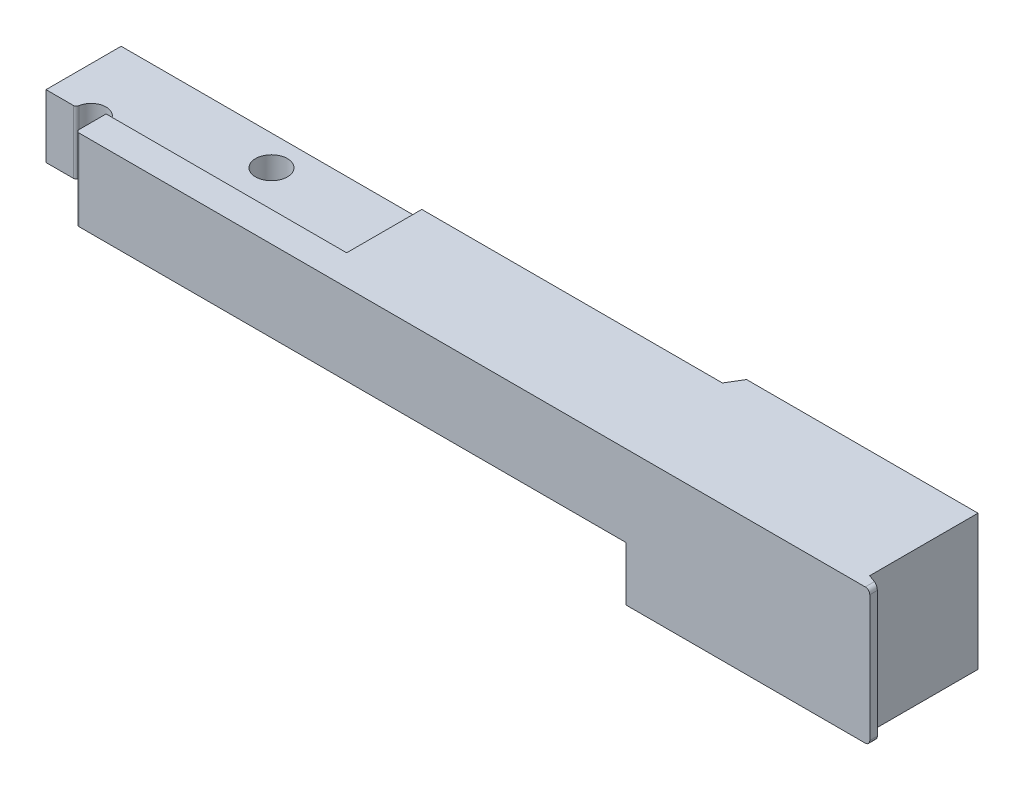
ISO-10303-21;
HEADER;
FILE_DESCRIPTION(('STEP AP214'),'2;1');
FILE_NAME('part.step','',(''),(''),'','','');
FILE_SCHEMA(('AUTOMOTIVE_DESIGN { 1 0 10303 214 1 1 1 1 }'));
ENDSEC;
DATA;
#1=APPLICATION_CONTEXT('core data for automotive mechanical design processes');
#2=APPLICATION_PROTOCOL_DEFINITION('international standard','automotive_design',2000,#1);
#3=PRODUCT_CONTEXT('',#1,'mechanical');
#4=PRODUCT('Part','Part','',(#3));
#5=PRODUCT_RELATED_PRODUCT_CATEGORY('part','',(#4));
#6=PRODUCT_DEFINITION_FORMATION('','',#4);
#7=PRODUCT_DEFINITION_CONTEXT('part definition',#1,'design');
#8=PRODUCT_DEFINITION('design','',#6,#7);
#9=PRODUCT_DEFINITION_SHAPE('','',#8);
#10=(LENGTH_UNIT() NAMED_UNIT(*) SI_UNIT(.MILLI.,.METRE.));
#11=(NAMED_UNIT(*) PLANE_ANGLE_UNIT() SI_UNIT($,.RADIAN.));
#12=(NAMED_UNIT(*) SI_UNIT($,.STERADIAN.) SOLID_ANGLE_UNIT());
#13=UNCERTAINTY_MEASURE_WITH_UNIT(LENGTH_MEASURE(1.E-05),#10,'distance_accuracy_value','');
#14=(GEOMETRIC_REPRESENTATION_CONTEXT(3) GLOBAL_UNCERTAINTY_ASSIGNED_CONTEXT((#13)) GLOBAL_UNIT_ASSIGNED_CONTEXT((#10,
#11,#12)) REPRESENTATION_CONTEXT('',''));
#15=CARTESIAN_POINT('',(0.,0.,0.));
#16=DIRECTION('',(0.,0.,1.));
#17=DIRECTION('',(1.,0.,0.));
#18=AXIS2_PLACEMENT_3D('',#15,#16,#17);
#19=CARTESIAN_POINT('',(0.,22.5,-20.));
#20=DIRECTION('',(0.,-1.,0.));
#21=DIRECTION('',(1.,0.,0.));
#22=AXIS2_PLACEMENT_3D('',#19,#20,#21);
#23=PLANE('',#22);
#24=DIRECTION('',(0.,0.,1.));
#25=VECTOR('',#24,1.);
#26=CARTESIAN_POINT('',(50.,22.5,-17.5));
#27=LINE('',#26,#25);
#28=CARTESIAN_POINT('',(50.,22.5,-17.5));
#29=VERTEX_POINT('',#28);
#30=CARTESIAN_POINT('',(50.,22.5,-5.));
#31=VERTEX_POINT('',#30);
#32=EDGE_CURVE('E199',#29,#31,#27,.T.);
#33=ORIENTED_EDGE('',*,*,#32,.T.);
#34=DIRECTION('',(-1.,0.,0.));
#35=VECTOR('',#34,1.);
#36=CARTESIAN_POINT('',(0.,22.5,-5.));
#37=LINE('',#36,#35);
#38=CARTESIAN_POINT('',(9.99999999999999,22.5,-5.));
#39=VERTEX_POINT('',#38);
#40=EDGE_CURVE('E454',#31,#39,#37,.T.);
#41=ORIENTED_EDGE('',*,*,#40,.T.);
#42=DIRECTION('',(0.,0.,-1.));
#43=VECTOR('',#42,1.);
#44=CARTESIAN_POINT('',(10.,22.5,0.));
#45=LINE('',#44,#43);
#46=CARTESIAN_POINT('',(10.,22.5,-0.5));
#47=VERTEX_POINT('',#46);
#48=EDGE_CURVE('E214',#47,#39,#45,.T.);
#49=ORIENTED_EDGE('',*,*,#48,.F.);
#50=CARTESIAN_POINT('',(10.5,22.5,-0.5));
#51=DIRECTION('',(0.,-1.,0.));
#52=DIRECTION('',(1.,0.,0.));
#53=AXIS2_PLACEMENT_3D('',#50,#51,#52);
#54=CIRCLE('',#53,0.5);
#55=CARTESIAN_POINT('',(10.5,22.5,0.));
#56=VERTEX_POINT('',#55);
#57=EDGE_CURVE('E308',#47,#56,#54,.F.);
#58=ORIENTED_EDGE('',*,*,#57,.T.);
#59=DIRECTION('',(1.,0.,0.));
#60=VECTOR('',#59,1.);
#61=CARTESIAN_POINT('',(0.,22.5,0.));
#62=LINE('',#61,#60);
#63=CARTESIAN_POINT('',(141.25,22.5,0.));
#64=VERTEX_POINT('',#63);
#65=EDGE_CURVE('E257',#56,#64,#62,.T.);
#66=ORIENTED_EDGE('',*,*,#65,.T.);
#67=DIRECTION('',(0.,0.,1.));
#68=VECTOR('',#67,1.);
#69=CARTESIAN_POINT('',(141.25,22.5,-1.24999999999999));
#70=LINE('',#69,#68);
#71=CARTESIAN_POINT('',(141.25,22.5,-1.52297767569964));
#72=VERTEX_POINT('',#71);
#73=EDGE_CURVE('E296',#64,#72,#70,.F.);
#74=ORIENTED_EDGE('',*,*,#73,.T.);
#75=DIRECTION('',(0.939692620785909,0.,0.342020143325667));
#76=VECTOR('',#75,1.);
#77=CARTESIAN_POINT('',(142.,22.5,-1.24999999999999));
#78=LINE('',#77,#76);
#79=CARTESIAN_POINT('',(140.,22.5,-1.97794046853239));
#80=VERTEX_POINT('',#79);
#81=EDGE_CURVE('E271',#72,#80,#78,.F.);
#82=ORIENTED_EDGE('',*,*,#81,.T.);
#83=DIRECTION('',(0.,0.,1.));
#84=VECTOR('',#83,1.);
#85=CARTESIAN_POINT('',(140.,22.5,-20.));
#86=LINE('',#85,#84);
#87=CARTESIAN_POINT('',(140.,22.5,-20.));
#88=VERTEX_POINT('',#87);
#89=EDGE_CURVE('E251',#88,#80,#86,.T.);
#90=ORIENTED_EDGE('',*,*,#89,.F.);
#91=DIRECTION('',(1.,0.,0.));
#92=VECTOR('',#91,1.);
#93=CARTESIAN_POINT('',(0.,22.5,-20.));
#94=LINE('',#93,#92);
#95=CARTESIAN_POINT('',(101.5,22.5,-20.));
#96=VERTEX_POINT('',#95);
#97=EDGE_CURVE('E258',#96,#88,#94,.T.);
#98=ORIENTED_EDGE('',*,*,#97,.F.);
#99=DIRECTION('',(-0.514495755427527,0.,0.857492925712544));
#100=VECTOR('',#99,1.);
#101=CARTESIAN_POINT('',(74.6323529411764,22.5,24.7794117647059));
#102=LINE('',#101,#100);
#103=CARTESIAN_POINT('',(100.,22.5,-17.5));
#104=VERTEX_POINT('',#103);
#105=EDGE_CURVE('E238',#96,#104,#102,.T.);
#106=ORIENTED_EDGE('',*,*,#105,.T.);
#107=DIRECTION('',(-1.,0.,0.));
#108=VECTOR('',#107,1.);
#109=CARTESIAN_POINT('',(0.,22.5,-17.5));
#110=LINE('',#109,#108);
#111=EDGE_CURVE('E246',#104,#29,#110,.T.);
#112=ORIENTED_EDGE('',*,*,#111,.T.);
#113=EDGE_LOOP('',(#33,#41,#49,#58,#66,#74,#82,#90,#98,#106,#112));
#114=FACE_BOUND('',#113,.T.);
#115=ADVANCED_FACE('F44',(#114),#23,.F.);
#116=CARTESIAN_POINT('',(100.,0.,-17.5));
#117=DIRECTION('',(0.,0.,1.));
#118=DIRECTION('',(1.,0.,0.));
#119=AXIS2_PLACEMENT_3D('',#116,#117,#118);
#120=PLANE('',#119);
#121=DIRECTION('',(0.,1.,0.));
#122=VECTOR('',#121,1.);
#123=CARTESIAN_POINT('',(50.,21.,-17.5));
#124=LINE('',#123,#122);
#125=CARTESIAN_POINT('',(50.,21.,-17.5));
#126=VERTEX_POINT('',#125);
#127=EDGE_CURVE('E339',#126,#29,#124,.T.);
#128=ORIENTED_EDGE('',*,*,#127,.T.);
#129=ORIENTED_EDGE('',*,*,#111,.F.);
#130=DIRECTION('',(0.,1.,0.));
#131=VECTOR('',#130,1.);
#132=CARTESIAN_POINT('',(100.,0.,-17.5));
#133=LINE('',#132,#131);
#134=CARTESIAN_POINT('',(100.,9.,-17.5));
#135=VERTEX_POINT('',#134);
#136=EDGE_CURVE('E233',#135,#104,#133,.T.);
#137=ORIENTED_EDGE('',*,*,#136,.F.);
#138=DIRECTION('',(1.,0.,0.));
#139=VECTOR('',#138,1.);
#140=CARTESIAN_POINT('',(0.,9.,-17.5));
#141=LINE('',#140,#139);
#142=CARTESIAN_POINT('',(50.,9.,-17.5));
#143=VERTEX_POINT('',#142);
#144=EDGE_CURVE('E376',#143,#135,#141,.T.);
#145=ORIENTED_EDGE('',*,*,#144,.F.);
#146=DIRECTION('',(0.,-1.,0.));
#147=VECTOR('',#146,1.);
#148=CARTESIAN_POINT('',(50.,10.5,-17.5));
#149=LINE('',#148,#147);
#150=CARTESIAN_POINT('',(50.,10.5,-17.5));
#151=VERTEX_POINT('',#150);
#152=EDGE_CURVE('E66',#151,#143,#149,.T.);
#153=ORIENTED_EDGE('',*,*,#152,.F.);
#154=DIRECTION('',(1.,0.,0.));
#155=VECTOR('',#154,1.);
#156=CARTESIAN_POINT('',(0.,10.5,-17.5));
#157=LINE('',#156,#155);
#158=CARTESIAN_POINT('',(0.,10.5,-17.5));
#159=VERTEX_POINT('',#158);
#160=EDGE_CURVE('E352',#159,#151,#157,.T.);
#161=ORIENTED_EDGE('',*,*,#160,.F.);
#162=DIRECTION('',(0.,1.,0.));
#163=VECTOR('',#162,1.);
#164=CARTESIAN_POINT('',(0.,0.,-17.5));
#165=LINE('',#164,#163);
#166=CARTESIAN_POINT('',(0.,21.,-17.5));
#167=VERTEX_POINT('',#166);
#168=EDGE_CURVE('E236',#159,#167,#165,.T.);
#169=ORIENTED_EDGE('',*,*,#168,.T.);
#170=DIRECTION('',(1.,0.,0.));
#171=VECTOR('',#170,1.);
#172=CARTESIAN_POINT('',(0.,21.,-17.5));
#173=LINE('',#172,#171);
#174=EDGE_CURVE('E194',#167,#126,#173,.T.);
#175=ORIENTED_EDGE('',*,*,#174,.T.);
#176=EDGE_LOOP('',(#128,#129,#137,#145,#153,#161,#169,#175));
#177=FACE_BOUND('',#176,.T.);
#178=ADVANCED_FACE('F433',(#177),#120,.F.);
#179=CARTESIAN_POINT('',(0.,0.,-20.));
#180=DIRECTION('',(0.,-1.,0.));
#181=DIRECTION('',(1.,0.,0.));
#182=AXIS2_PLACEMENT_3D('',#179,#180,#181);
#183=PLANE('',#182);
#184=DIRECTION('',(0.,0.,1.));
#185=VECTOR('',#184,1.);
#186=CARTESIAN_POINT('',(101.5,0.,-20.001));
#187=LINE('',#186,#185);
#188=CARTESIAN_POINT('',(101.5,0.,-20.));
#189=VERTEX_POINT('',#188);
#190=CARTESIAN_POINT('',(101.5,0.,0.));
#191=VERTEX_POINT('',#190);
#192=EDGE_CURVE('E220',#189,#191,#187,.T.);
#193=ORIENTED_EDGE('',*,*,#192,.F.);
#194=DIRECTION('',(1.,0.,0.));
#195=VECTOR('',#194,1.);
#196=CARTESIAN_POINT('',(0.,0.,-20.));
#197=LINE('',#196,#195);
#198=CARTESIAN_POINT('',(140.,0.,-20.));
#199=VERTEX_POINT('',#198);
#200=EDGE_CURVE('E260',#189,#199,#197,.T.);
#201=ORIENTED_EDGE('',*,*,#200,.T.);
#202=DIRECTION('',(0.,0.,1.));
#203=VECTOR('',#202,1.);
#204=CARTESIAN_POINT('',(140.,0.,-20.));
#205=LINE('',#204,#203);
#206=CARTESIAN_POINT('',(140.,0.,-1.97794046853239));
#207=VERTEX_POINT('',#206);
#208=EDGE_CURVE('E249',#199,#207,#205,.T.);
#209=ORIENTED_EDGE('',*,*,#208,.T.);
#210=DIRECTION('',(-0.939692620785909,0.,-0.342020143325667));
#211=VECTOR('',#210,1.);
#212=CARTESIAN_POINT('',(10.5847106977411,0.,-49.0812536335036));
#213=LINE('',#212,#211);
#214=CARTESIAN_POINT('',(141.25,0.,-1.52297767569964));
#215=VERTEX_POINT('',#214);
#216=EDGE_CURVE('E273',#207,#215,#213,.F.);
#217=ORIENTED_EDGE('',*,*,#216,.T.);
#218=DIRECTION('',(0.,0.,1.));
#219=VECTOR('',#218,1.);
#220=CARTESIAN_POINT('',(141.25,0.,-20.));
#221=LINE('',#220,#219);
#222=CARTESIAN_POINT('',(141.25,0.,0.));
#223=VERTEX_POINT('',#222);
#224=EDGE_CURVE('E279',#215,#223,#221,.T.);
#225=ORIENTED_EDGE('',*,*,#224,.T.);
#226=DIRECTION('',(1.,0.,0.));
#227=VECTOR('',#226,1.);
#228=CARTESIAN_POINT('',(0.,0.,0.));
#229=LINE('',#228,#227);
#230=EDGE_CURVE('E261',#191,#223,#229,.T.);
#231=ORIENTED_EDGE('',*,*,#230,.F.);
#232=EDGE_LOOP('',(#193,#201,#209,#217,#225,#231));
#233=FACE_BOUND('',#232,.T.);
#234=ADVANCED_FACE('F394',(#233),#183,.T.);
#235=CARTESIAN_POINT('',(142.,0.,-20.));
#236=DIRECTION('',(1.,0.,0.));
#237=DIRECTION('',(0.,0.,-1.));
#238=AXIS2_PLACEMENT_3D('',#235,#236,#237);
#239=PLANE('',#238);
#240=DIRECTION('',(0.,1.,0.));
#241=VECTOR('',#240,1.);
#242=CARTESIAN_POINT('',(142.,0.,0.));
#243=LINE('',#242,#241);
#244=CARTESIAN_POINT('',(142.,0.750000000000017,0.));
#245=VERTEX_POINT('',#244);
#246=CARTESIAN_POINT('',(142.,21.75,0.));
#247=VERTEX_POINT('',#246);
#248=EDGE_CURVE('E265',#245,#247,#243,.T.);
#249=ORIENTED_EDGE('',*,*,#248,.F.);
#250=DIRECTION('',(0.,0.,1.));
#251=VECTOR('',#250,1.);
#252=CARTESIAN_POINT('',(142.,0.750000000000017,-20.));
#253=LINE('',#252,#251);
#254=CARTESIAN_POINT('',(142.,0.750000000000017,-1.24999999999999));
#255=VERTEX_POINT('',#254);
#256=EDGE_CURVE('E290',#245,#255,#253,.F.);
#257=ORIENTED_EDGE('',*,*,#256,.T.);
#258=DIRECTION('',(0.,1.,0.));
#259=VECTOR('',#258,1.);
#260=CARTESIAN_POINT('',(142.,0.,-1.24999999999999));
#261=LINE('',#260,#259);
#262=CARTESIAN_POINT('',(142.,21.75,-1.24999999999999));
#263=VERTEX_POINT('',#262);
#264=EDGE_CURVE('E263',#255,#263,#261,.T.);
#265=ORIENTED_EDGE('',*,*,#264,.T.);
#266=DIRECTION('',(0.,0.,1.));
#267=VECTOR('',#266,1.);
#268=CARTESIAN_POINT('',(142.,21.75,0.));
#269=LINE('',#268,#267);
#270=EDGE_CURVE('E287',#263,#247,#269,.T.);
#271=ORIENTED_EDGE('',*,*,#270,.T.);
#272=EDGE_LOOP('',(#249,#257,#265,#271));
#273=FACE_BOUND('',#272,.T.);
#274=ADVANCED_FACE('F403',(#273),#239,.T.);
#275=CARTESIAN_POINT('',(0.,0.,-20.));
#276=DIRECTION('',(1.,0.,0.));
#277=DIRECTION('',(0.,0.,-1.));
#278=AXIS2_PLACEMENT_3D('',#275,#276,#277);
#279=PLANE('',#278);
#280=DIRECTION('',(0.,1.,0.));
#281=VECTOR('',#280,1.);
#282=CARTESIAN_POINT('',(0.,-0.00100000000003569,-5.));
#283=LINE('',#282,#281);
#284=CARTESIAN_POINT('',(0.,10.5,-5.));
#285=VERTEX_POINT('',#284);
#286=CARTESIAN_POINT('',(0.,21.,-5.));
#287=VERTEX_POINT('',#286);
#288=EDGE_CURVE('E206',#285,#287,#283,.T.);
#289=ORIENTED_EDGE('',*,*,#288,.T.);
#290=DIRECTION('',(0.,0.,-1.));
#291=VECTOR('',#290,1.);
#292=CARTESIAN_POINT('',(0.,21.,-17.5));
#293=LINE('',#292,#291);
#294=EDGE_CURVE('E188',#287,#167,#293,.T.);
#295=ORIENTED_EDGE('',*,*,#294,.T.);
#296=ORIENTED_EDGE('',*,*,#168,.F.);
#297=DIRECTION('',(0.,0.,-1.));
#298=VECTOR('',#297,1.);
#299=CARTESIAN_POINT('',(0.,10.5,-17.5));
#300=LINE('',#299,#298);
#301=EDGE_CURVE('E213',#285,#159,#300,.T.);
#302=ORIENTED_EDGE('',*,*,#301,.F.);
#303=EDGE_LOOP('',(#289,#295,#296,#302));
#304=FACE_BOUND('',#303,.T.);
#305=ADVANCED_FACE('F212',(#304),#279,.F.);
#306=CARTESIAN_POINT('',(0.,0.,-20.));
#307=DIRECTION('',(0.,0.,-1.));
#308=DIRECTION('',(-1.,0.,0.));
#309=AXIS2_PLACEMENT_3D('',#306,#307,#308);
#310=PLANE('',#309);
#311=CARTESIAN_POINT('',(115.5,11.25,-20.));
#312=DIRECTION('',(0.,0.,-1.));
#313=DIRECTION('',(-1.,0.,0.));
#314=AXIS2_PLACEMENT_3D('',#311,#312,#313);
#315=CIRCLE('',#314,3.35);
#316=CARTESIAN_POINT('',(112.15,11.25,-20.));
#317=VERTEX_POINT('',#316);
#318=EDGE_CURVE('E226',#317,#317,#315,.T.);
#319=ORIENTED_EDGE('',*,*,#318,.F.);
#320=EDGE_LOOP('',(#319));
#321=FACE_BOUND('',#320,.T.);
#322=DIRECTION('',(0.,1.,0.));
#323=VECTOR('',#322,1.);
#324=CARTESIAN_POINT('',(101.5,0.,-20.));
#325=LINE('',#324,#323);
#326=CARTESIAN_POINT('',(101.5,9.,-20.));
#327=VERTEX_POINT('',#326);
#328=EDGE_CURVE('E239',#189,#327,#325,.T.);
#329=ORIENTED_EDGE('',*,*,#328,.T.);
#330=EDGE_CURVE('E242',#327,#96,#325,.T.);
#331=ORIENTED_EDGE('',*,*,#330,.T.);
#332=ORIENTED_EDGE('',*,*,#97,.T.);
#333=DIRECTION('',(0.,1.,0.));
#334=VECTOR('',#333,1.);
#335=CARTESIAN_POINT('',(140.,0.,-20.));
#336=LINE('',#335,#334);
#337=EDGE_CURVE('E254',#199,#88,#336,.T.);
#338=ORIENTED_EDGE('',*,*,#337,.F.);
#339=ORIENTED_EDGE('',*,*,#200,.F.);
#340=EDGE_LOOP('',(#329,#331,#332,#338,#339));
#341=FACE_BOUND('',#340,.T.);
#342=ADVANCED_FACE('F441',(#321,#341),#310,.T.);
#343=CARTESIAN_POINT('',(0.,0.,0.));
#344=DIRECTION('',(0.,0.,-1.));
#345=DIRECTION('',(-1.,0.,0.));
#346=AXIS2_PLACEMENT_3D('',#343,#344,#345);
#347=PLANE('',#346);
#348=DIRECTION('',(-1.,0.,0.));
#349=VECTOR('',#348,1.);
#350=CARTESIAN_POINT('',(0.,9.,0.));
#351=LINE('',#350,#349);
#352=CARTESIAN_POINT('',(101.5,9.,0.));
#353=VERTEX_POINT('',#352);
#354=CARTESIAN_POINT('',(10.5,9.,0.));
#355=VERTEX_POINT('',#354);
#356=EDGE_CURVE('E381',#353,#355,#351,.T.);
#357=ORIENTED_EDGE('',*,*,#356,.F.);
#358=DIRECTION('',(0.,1.,0.));
#359=VECTOR('',#358,1.);
#360=CARTESIAN_POINT('',(101.5,0.,0.));
#361=LINE('',#360,#359);
#362=EDGE_CURVE('E378',#191,#353,#361,.T.);
#363=ORIENTED_EDGE('',*,*,#362,.F.);
#364=ORIENTED_EDGE('',*,*,#230,.T.);
#365=CARTESIAN_POINT('',(141.25,0.750000000000017,0.));
#366=DIRECTION('',(0.,0.,-1.));
#367=DIRECTION('',(-1.,0.,0.));
#368=AXIS2_PLACEMENT_3D('',#365,#366,#367);
#369=CIRCLE('',#368,0.75);
#370=EDGE_CURVE('E285',#223,#245,#369,.F.);
#371=ORIENTED_EDGE('',*,*,#370,.T.);
#372=ORIENTED_EDGE('',*,*,#248,.T.);
#373=CARTESIAN_POINT('',(141.25,21.75,0.));
#374=DIRECTION('',(0.,0.,-1.));
#375=DIRECTION('',(-1.,0.,0.));
#376=AXIS2_PLACEMENT_3D('',#373,#374,#375);
#377=CIRCLE('',#376,0.75);
#378=EDGE_CURVE('E282',#247,#64,#377,.F.);
#379=ORIENTED_EDGE('',*,*,#378,.T.);
#380=ORIENTED_EDGE('',*,*,#65,.F.);
#381=DIRECTION('',(0.,1.,0.));
#382=VECTOR('',#381,1.);
#383=CARTESIAN_POINT('',(10.5,0.,0.));
#384=LINE('',#383,#382);
#385=EDGE_CURVE('E314',#56,#355,#384,.F.);
#386=ORIENTED_EDGE('',*,*,#385,.T.);
#387=EDGE_LOOP('',(#357,#363,#364,#371,#372,#379,#380,#386));
#388=FACE_BOUND('',#387,.T.);
#389=ADVANCED_FACE('F392',(#388),#347,.F.);
#390=CARTESIAN_POINT('',(140.,0.,0.));
#391=DIRECTION('',(-1.,0.,0.));
#392=DIRECTION('',(0.,0.,1.));
#393=AXIS2_PLACEMENT_3D('',#390,#391,#392);
#394=PLANE('',#393);
#395=ORIENTED_EDGE('',*,*,#208,.F.);
#396=ORIENTED_EDGE('',*,*,#337,.T.);
#397=ORIENTED_EDGE('',*,*,#89,.T.);
#398=DIRECTION('',(0.,1.,0.));
#399=VECTOR('',#398,1.);
#400=CARTESIAN_POINT('',(140.,0.,-1.97794046853239));
#401=LINE('',#400,#399);
#402=EDGE_CURVE('E276',#80,#207,#401,.F.);
#403=ORIENTED_EDGE('',*,*,#402,.T.);
#404=EDGE_LOOP('',(#395,#396,#397,#403));
#405=FACE_BOUND('',#404,.T.);
#406=ADVANCED_FACE('F445',(#405),#394,.F.);
#407=CARTESIAN_POINT('',(142.,0.,-1.24999999999999));
#408=DIRECTION('',(-0.342020143325667,0.,0.939692620785909));
#409=DIRECTION('',(0.,1.,0.));
#410=AXIS2_PLACEMENT_3D('',#407,#408,#409);
#411=PLANE('',#410);
#412=ORIENTED_EDGE('',*,*,#264,.F.);
#413=CARTESIAN_POINT('',(141.25,0.750000000000017,-1.52297767569964));
#414=DIRECTION('',(-0.342020143325667,0.,0.939692620785909));
#415=DIRECTION('',(0.939692620785909,0.,0.342020143325667));
#416=AXIS2_PLACEMENT_3D('',#413,#414,#415);
#417=ELLIPSE('',#416,0.798133329356934,0.75);
#418=EDGE_CURVE('E294',#255,#215,#417,.F.);
#419=ORIENTED_EDGE('',*,*,#418,.T.);
#420=ORIENTED_EDGE('',*,*,#216,.F.);
#421=ORIENTED_EDGE('',*,*,#402,.F.);
#422=ORIENTED_EDGE('',*,*,#81,.F.);
#423=CARTESIAN_POINT('',(141.25,21.75,-1.52297767569964));
#424=DIRECTION('',(-0.342020143325667,0.,0.939692620785909));
#425=DIRECTION('',(-0.939692620785909,0.,-0.342020143325667));
#426=AXIS2_PLACEMENT_3D('',#423,#424,#425);
#427=ELLIPSE('',#426,0.798133329356934,0.75);
#428=EDGE_CURVE('E292',#72,#263,#427,.F.);
#429=ORIENTED_EDGE('',*,*,#428,.T.);
#430=EDGE_LOOP('',(#412,#419,#420,#421,#422,#429));
#431=FACE_BOUND('',#430,.T.);
#432=ADVANCED_FACE('F450',(#431),#411,.F.);
#433=CARTESIAN_POINT('',(141.25,0.750000000000017,-20.));
#434=DIRECTION('',(0.,0.,1.));
#435=DIRECTION('',(1.,0.,0.));
#436=AXIS2_PLACEMENT_3D('',#433,#434,#435);
#437=CYLINDRICAL_SURFACE('',#436,0.75);
#438=ORIENTED_EDGE('',*,*,#418,.F.);
#439=ORIENTED_EDGE('',*,*,#256,.F.);
#440=ORIENTED_EDGE('',*,*,#370,.F.);
#441=ORIENTED_EDGE('',*,*,#224,.F.);
#442=EDGE_LOOP('',(#438,#439,#440,#441));
#443=FACE_BOUND('',#442,.T.);
#444=ADVANCED_FACE('F399',(#443),#437,.T.);
#445=CARTESIAN_POINT('',(141.25,21.75,-20.));
#446=DIRECTION('',(0.,0.,-1.));
#447=DIRECTION('',(-1.,0.,0.));
#448=AXIS2_PLACEMENT_3D('',#445,#446,#447);
#449=CYLINDRICAL_SURFACE('',#448,0.75);
#450=ORIENTED_EDGE('',*,*,#428,.F.);
#451=ORIENTED_EDGE('',*,*,#73,.F.);
#452=ORIENTED_EDGE('',*,*,#378,.F.);
#453=ORIENTED_EDGE('',*,*,#270,.F.);
#454=EDGE_LOOP('',(#450,#451,#452,#453));
#455=FACE_BOUND('',#454,.T.);
#456=ADVANCED_FACE('F408',(#455),#449,.T.);
#457=CARTESIAN_POINT('',(100.,0.,-17.5));
#458=DIRECTION('',(0.857492925712544,0.,0.514495755427527));
#459=DIRECTION('',(0.514495755427527,0.,-0.857492925712544));
#460=AXIS2_PLACEMENT_3D('',#457,#458,#459);
#461=PLANE('',#460);
#462=ORIENTED_EDGE('',*,*,#330,.F.);
#463=DIRECTION('',(0.514495755427527,0.,-0.857492925712544));
#464=VECTOR('',#463,1.);
#465=CARTESIAN_POINT('',(74.632794117647,9.,24.7786764705883));
#466=LINE('',#465,#464);
#467=EDGE_CURVE('E373',#135,#327,#466,.T.);
#468=ORIENTED_EDGE('',*,*,#467,.F.);
#469=ORIENTED_EDGE('',*,*,#136,.T.);
#470=ORIENTED_EDGE('',*,*,#105,.F.);
#471=EDGE_LOOP('',(#462,#468,#469,#470));
#472=FACE_BOUND('',#471,.T.);
#473=ADVANCED_FACE('F438',(#472),#461,.F.);
#474=CARTESIAN_POINT('',(30.,-0.00100000000003223,-12.5));
#475=DIRECTION('',(0.,1.,0.));
#476=DIRECTION('',(-1.,0.,0.));
#477=AXIS2_PLACEMENT_3D('',#474,#475,#476);
#478=CYLINDRICAL_SURFACE('',#477,2.65);
#479=CARTESIAN_POINT('',(30.,21.,-12.5));
#480=DIRECTION('',(0.,-1.,0.));
#481=DIRECTION('',(1.,0.,0.));
#482=AXIS2_PLACEMENT_3D('',#479,#480,#481);
#483=CIRCLE('',#482,2.65);
#484=CARTESIAN_POINT('',(32.65,21.,-12.5));
#485=VERTEX_POINT('',#484);
#486=EDGE_CURVE('E338',#485,#485,#483,.F.);
#487=ORIENTED_EDGE('',*,*,#486,.T.);
#488=EDGE_LOOP('',(#487));
#489=FACE_BOUND('',#488,.T.);
#490=CARTESIAN_POINT('',(30.,10.5,-12.5));
#491=DIRECTION('',(0.,1.,0.));
#492=DIRECTION('',(0.,0.,1.));
#493=AXIS2_PLACEMENT_3D('',#490,#491,#492);
#494=CIRCLE('',#493,2.65);
#495=CARTESIAN_POINT('',(30.,10.5,-9.85));
#496=VERTEX_POINT('',#495);
#497=EDGE_CURVE('E364',#496,#496,#494,.F.);
#498=ORIENTED_EDGE('',*,*,#497,.T.);
#499=EDGE_LOOP('',(#498));
#500=FACE_BOUND('',#499,.T.);
#501=ADVANCED_FACE('F531',(#489,#500),#478,.F.);
#502=CARTESIAN_POINT('',(115.5,11.25,-15.));
#503=DIRECTION('',(0.,0.,-1.));
#504=DIRECTION('',(-1.,0.,0.));
#505=AXIS2_PLACEMENT_3D('',#502,#503,#504);
#506=CYLINDRICAL_SURFACE('',#505,2.95);
#507=CARTESIAN_POINT('',(115.5,11.25,-17.0000000000012));
#508=DIRECTION('',(0.,0.,-1.));
#509=DIRECTION('',(-1.,0.,0.));
#510=AXIS2_PLACEMENT_3D('',#507,#508,#509);
#511=CIRCLE('',#510,2.95);
#512=CARTESIAN_POINT('',(112.55,11.25,-17.0000000000012));
#513=VERTEX_POINT('',#512);
#514=EDGE_CURVE('E298',#513,#513,#511,.F.);
#515=ORIENTED_EDGE('',*,*,#514,.T.);
#516=EDGE_LOOP('',(#515));
#517=FACE_BOUND('',#516,.T.);
#518=CARTESIAN_POINT('',(115.5,11.25,-15.));
#519=DIRECTION('',(0.,0.,-1.));
#520=DIRECTION('',(-1.,0.,0.));
#521=AXIS2_PLACEMENT_3D('',#518,#519,#520);
#522=CIRCLE('',#521,2.95);
#523=CARTESIAN_POINT('',(112.55,11.25,-15.));
#524=VERTEX_POINT('',#523);
#525=EDGE_CURVE('E227',#524,#524,#522,.T.);
#526=ORIENTED_EDGE('',*,*,#525,.T.);
#527=EDGE_LOOP('',(#526));
#528=FACE_BOUND('',#527,.T.);
#529=ADVANCED_FACE('F527',(#517,#528),#506,.T.);
#530=CARTESIAN_POINT('',(115.5,11.25,-15.));
#531=DIRECTION('',(0.,0.,-1.));
#532=DIRECTION('',(-1.,0.,0.));
#533=AXIS2_PLACEMENT_3D('',#530,#531,#532);
#534=CYLINDRICAL_SURFACE('',#533,3.35);
#535=CARTESIAN_POINT('',(115.5,11.25,-15.));
#536=DIRECTION('',(0.,0.,-1.));
#537=DIRECTION('',(-1.,0.,0.));
#538=AXIS2_PLACEMENT_3D('',#535,#536,#537);
#539=CIRCLE('',#538,3.35);
#540=CARTESIAN_POINT('',(112.15,11.25,-15.));
#541=VERTEX_POINT('',#540);
#542=EDGE_CURVE('E230',#541,#541,#539,.T.);
#543=ORIENTED_EDGE('',*,*,#542,.F.);
#544=EDGE_LOOP('',(#543));
#545=FACE_BOUND('',#544,.T.);
#546=ORIENTED_EDGE('',*,*,#318,.T.);
#547=EDGE_LOOP('',(#546));
#548=FACE_BOUND('',#547,.T.);
#549=ADVANCED_FACE('F523',(#545,#548),#534,.F.);
#550=CARTESIAN_POINT('',(0.,0.,-15.));
#551=DIRECTION('',(0.,0.,-1.));
#552=DIRECTION('',(-1.,0.,0.));
#553=AXIS2_PLACEMENT_3D('',#550,#551,#552);
#554=PLANE('',#553);
#555=ORIENTED_EDGE('',*,*,#525,.F.);
#556=EDGE_LOOP('',(#555));
#557=FACE_BOUND('',#556,.T.);
#558=ORIENTED_EDGE('',*,*,#542,.T.);
#559=EDGE_LOOP('',(#558));
#560=FACE_BOUND('',#559,.T.);
#561=ADVANCED_FACE('F520',(#557,#560),#554,.T.);
#562=CARTESIAN_POINT('',(115.5,11.25,-20.));
#563=DIRECTION('',(0.,0.,-1.));
#564=DIRECTION('',(-1.,0.,0.));
#565=AXIS2_PLACEMENT_3D('',#562,#563,#564);
#566=CIRCLE('',#565,1.77120283540492);
#567=CARTESIAN_POINT('',(113.728797164595,11.25,-20.));
#568=VERTEX_POINT('',#567);
#569=EDGE_CURVE('E301',#568,#568,#566,.T.);
#570=ORIENTED_EDGE('',*,*,#569,.T.);
#571=EDGE_LOOP('',(#570));
#572=FACE_BOUND('',#571,.T.);
#573=ADVANCED_FACE('F500',(#572),#310,.T.);
#574=CARTESIAN_POINT('',(115.5,11.25,-20.));
#575=DIRECTION('',(0.,0.,1.));
#576=DIRECTION('',(1.,0.,0.));
#577=AXIS2_PLACEMENT_3D('',#574,#575,#576);
#578=CONICAL_SURFACE('',#577,2.68753400942234,0.0872664625997127);
#579=CARTESIAN_POINT('',(115.5,11.25,-19.0871557427477));
#580=DIRECTION('',(0.,0.,-1.));
#581=DIRECTION('',(-1.,0.,0.));
#582=AXIS2_PLACEMENT_3D('',#579,#580,#581);
#583=CIRCLE('',#582,2.76739753349666);
#584=CARTESIAN_POINT('',(112.732602466503,11.25,-19.0871557427477));
#585=VERTEX_POINT('',#584);
#586=EDGE_CURVE('E304',#585,#585,#583,.F.);
#587=ORIENTED_EDGE('',*,*,#586,.T.);
#588=EDGE_LOOP('',(#587));
#589=FACE_BOUND('',#588,.T.);
#590=ORIENTED_EDGE('',*,*,#514,.F.);
#591=EDGE_LOOP('',(#590));
#592=FACE_BOUND('',#591,.T.);
#593=ADVANCED_FACE('F494',(#589,#592),#578,.T.);
#594=CARTESIAN_POINT('',(115.5,11.25,-19.));
#595=DIRECTION('',(0.,0.,-1.));
#596=DIRECTION('',(-1.,0.,0.));
#597=AXIS2_PLACEMENT_3D('',#594,#595,#596);
#598=TOROIDAL_SURFACE('',#597,1.77120283540492,1.);
#599=ORIENTED_EDGE('',*,*,#586,.F.);
#600=EDGE_LOOP('',(#599));
#601=FACE_BOUND('',#600,.T.);
#602=ORIENTED_EDGE('',*,*,#569,.F.);
#603=EDGE_LOOP('',(#602));
#604=FACE_BOUND('',#603,.T.);
#605=ADVANCED_FACE('F499',(#601,#604),#598,.T.);
#606=CARTESIAN_POINT('',(7.5,-0.00100000000003569,-5.));
#607=DIRECTION('',(0.,1.,0.));
#608=DIRECTION('',(-1.,0.,0.));
#609=AXIS2_PLACEMENT_3D('',#606,#607,#608);
#610=CYLINDRICAL_SURFACE('',#609,2.5);
#611=DIRECTION('',(0.,1.,0.));
#612=VECTOR('',#611,1.);
#613=CARTESIAN_POINT('',(10.,-0.00100000000003569,-5.));
#614=LINE('',#613,#612);
#615=CARTESIAN_POINT('',(10.,10.5,-5.));
#616=VERTEX_POINT('',#615);
#617=CARTESIAN_POINT('',(9.99999999999999,21.,-5.));
#618=VERTEX_POINT('',#617);
#619=EDGE_CURVE('E218',#616,#618,#614,.T.);
#620=ORIENTED_EDGE('',*,*,#619,.T.);
#621=CARTESIAN_POINT('',(7.5,21.,-5.));
#622=DIRECTION('',(0.,-1.,0.));
#623=DIRECTION('',(1.,0.,0.));
#624=AXIS2_PLACEMENT_3D('',#621,#622,#623);
#625=CIRCLE('',#624,2.5);
#626=CARTESIAN_POINT('',(5.03496675704183,21.,-5.41666666666667));
#627=VERTEX_POINT('',#626);
#628=EDGE_CURVE('E332',#618,#627,#625,.F.);
#629=ORIENTED_EDGE('',*,*,#628,.T.);
#630=DIRECTION('',(0.,1.,0.));
#631=VECTOR('',#630,1.);
#632=CARTESIAN_POINT('',(5.03496675704183,-0.001000000000036,-5.41666666666667));
#633=LINE('',#632,#631);
#634=CARTESIAN_POINT('',(5.03496675704183,10.5,-5.41666666666667));
#635=VERTEX_POINT('',#634);
#636=EDGE_CURVE('E310',#627,#635,#633,.F.);
#637=ORIENTED_EDGE('',*,*,#636,.T.);
#638=CARTESIAN_POINT('',(7.5,10.5,-5.));
#639=DIRECTION('',(0.,1.,0.));
#640=DIRECTION('',(0.,0.,1.));
#641=AXIS2_PLACEMENT_3D('',#638,#639,#640);
#642=CIRCLE('',#641,2.5);
#643=EDGE_CURVE('E324',#635,#616,#642,.F.);
#644=ORIENTED_EDGE('',*,*,#643,.T.);
#645=EDGE_LOOP('',(#620,#629,#637,#644));
#646=FACE_BOUND('',#645,.T.);
#647=ADVANCED_FACE('F336',(#646),#610,.F.);
#648=CARTESIAN_POINT('',(10.,-0.00100000000003569,0.));
#649=DIRECTION('',(1.,0.,0.));
#650=DIRECTION('',(0.,0.,-1.));
#651=AXIS2_PLACEMENT_3D('',#648,#649,#650);
#652=PLANE('',#651);
#653=CARTESIAN_POINT('',(10.,9.,-5.));
#654=VERTEX_POINT('',#653);
#655=EDGE_CURVE('E224',#654,#616,#614,.T.);
#656=ORIENTED_EDGE('',*,*,#655,.F.);
#657=DIRECTION('',(0.,0.,-1.));
#658=VECTOR('',#657,1.);
#659=CARTESIAN_POINT('',(9.99999999999999,9.,-20.001));
#660=LINE('',#659,#658);
#661=CARTESIAN_POINT('',(10.,9.,-0.5));
#662=VERTEX_POINT('',#661);
#663=EDGE_CURVE('E370',#662,#654,#660,.T.);
#664=ORIENTED_EDGE('',*,*,#663,.F.);
#665=DIRECTION('',(0.,1.,0.));
#666=VECTOR('',#665,1.);
#667=CARTESIAN_POINT('',(10.,-0.00100000000003569,-0.5));
#668=LINE('',#667,#666);
#669=EDGE_CURVE('E312',#662,#47,#668,.T.);
#670=ORIENTED_EDGE('',*,*,#669,.T.);
#671=ORIENTED_EDGE('',*,*,#48,.T.);
#672=DIRECTION('',(0.,1.,0.));
#673=VECTOR('',#672,1.);
#674=CARTESIAN_POINT('',(10.,-0.00100000000003569,-5.));
#675=LINE('',#674,#673);
#676=EDGE_CURVE('E342',#618,#39,#675,.T.);
#677=ORIENTED_EDGE('',*,*,#676,.F.);
#678=ORIENTED_EDGE('',*,*,#619,.F.);
#679=EDGE_LOOP('',(#656,#664,#670,#671,#677,#678));
#680=FACE_BOUND('',#679,.T.);
#681=ADVANCED_FACE('F422',(#680),#652,.F.);
#682=CARTESIAN_POINT('',(0.,-0.00100000000003569,-5.));
#683=DIRECTION('',(0.,0.,-1.));
#684=DIRECTION('',(-1.,0.,0.));
#685=AXIS2_PLACEMENT_3D('',#682,#683,#684);
#686=PLANE('',#685);
#687=DIRECTION('',(0.,1.,0.));
#688=VECTOR('',#687,1.);
#689=CARTESIAN_POINT('',(4.54196010845019,-0.00100000000003514,-5.));
#690=LINE('',#689,#688);
#691=CARTESIAN_POINT('',(4.54196010845019,10.5,-5.));
#692=VERTEX_POINT('',#691);
#693=CARTESIAN_POINT('',(4.54196010845019,21.,-5.));
#694=VERTEX_POINT('',#693);
#695=EDGE_CURVE('E208',#692,#694,#690,.T.);
#696=ORIENTED_EDGE('',*,*,#695,.T.);
#697=DIRECTION('',(-1.,0.,0.));
#698=VECTOR('',#697,1.);
#699=CARTESIAN_POINT('',(0.,21.,-5.));
#700=LINE('',#699,#698);
#701=EDGE_CURVE('E58',#694,#287,#700,.T.);
#702=ORIENTED_EDGE('',*,*,#701,.T.);
#703=ORIENTED_EDGE('',*,*,#288,.F.);
#704=DIRECTION('',(-1.,0.,0.));
#705=VECTOR('',#704,1.);
#706=CARTESIAN_POINT('',(0.,10.5,-5.));
#707=LINE('',#706,#705);
#708=EDGE_CURVE('E321',#692,#285,#707,.T.);
#709=ORIENTED_EDGE('',*,*,#708,.F.);
#710=EDGE_LOOP('',(#696,#702,#703,#709));
#711=FACE_BOUND('',#710,.T.);
#712=ADVANCED_FACE('F204',(#711),#686,.F.);
#713=CARTESIAN_POINT('',(4.54196010845019,-0.00100000000003606,-5.5));
#714=DIRECTION('',(0.,1.,0.));
#715=DIRECTION('',(-1.,0.,0.));
#716=AXIS2_PLACEMENT_3D('',#713,#714,#715);
#717=CYLINDRICAL_SURFACE('',#716,0.5);
#718=CARTESIAN_POINT('',(4.54196010845019,21.,-5.5));
#719=DIRECTION('',(0.,-1.,0.));
#720=DIRECTION('',(1.,0.,0.));
#721=AXIS2_PLACEMENT_3D('',#718,#719,#720);
#722=CIRCLE('',#721,0.5);
#723=EDGE_CURVE('E11',#694,#627,#722,.F.);
#724=ORIENTED_EDGE('',*,*,#723,.F.);
#725=ORIENTED_EDGE('',*,*,#695,.F.);
#726=CARTESIAN_POINT('',(4.54196010845019,10.5,-5.5));
#727=DIRECTION('',(0.,1.,0.));
#728=DIRECTION('',(0.,0.,1.));
#729=AXIS2_PLACEMENT_3D('',#726,#727,#728);
#730=CIRCLE('',#729,0.5);
#731=EDGE_CURVE('E52',#635,#692,#730,.F.);
#732=ORIENTED_EDGE('',*,*,#731,.F.);
#733=ORIENTED_EDGE('',*,*,#636,.F.);
#734=EDGE_LOOP('',(#724,#725,#732,#733));
#735=FACE_BOUND('',#734,.T.);
#736=ADVANCED_FACE('F330',(#735),#717,.T.);
#737=CARTESIAN_POINT('',(10.5,-0.00100000000003563,-0.5));
#738=DIRECTION('',(0.,1.,0.));
#739=DIRECTION('',(-1.,0.,0.));
#740=AXIS2_PLACEMENT_3D('',#737,#738,#739);
#741=CYLINDRICAL_SURFACE('',#740,0.5);
#742=CARTESIAN_POINT('',(10.5,9.,-0.5));
#743=DIRECTION('',(0.,1.,0.));
#744=DIRECTION('',(0.,0.,1.));
#745=AXIS2_PLACEMENT_3D('',#742,#743,#744);
#746=CIRCLE('',#745,0.5);
#747=EDGE_CURVE('E367',#662,#355,#746,.T.);
#748=ORIENTED_EDGE('',*,*,#747,.T.);
#749=ORIENTED_EDGE('',*,*,#385,.F.);
#750=ORIENTED_EDGE('',*,*,#57,.F.);
#751=ORIENTED_EDGE('',*,*,#669,.F.);
#752=EDGE_LOOP('',(#748,#749,#750,#751));
#753=FACE_BOUND('',#752,.T.);
#754=ADVANCED_FACE('F46',(#753),#741,.T.);
#755=CARTESIAN_POINT('',(101.5,0.,-20.001));
#756=DIRECTION('',(1.,0.,0.));
#757=DIRECTION('',(0.,0.,-1.));
#758=AXIS2_PLACEMENT_3D('',#755,#756,#757);
#759=PLANE('',#758);
#760=ORIENTED_EDGE('',*,*,#328,.F.);
#761=ORIENTED_EDGE('',*,*,#192,.T.);
#762=ORIENTED_EDGE('',*,*,#362,.T.);
#763=DIRECTION('',(0.,0.,1.));
#764=VECTOR('',#763,1.);
#765=CARTESIAN_POINT('',(101.5,9.,-20.001));
#766=LINE('',#765,#764);
#767=EDGE_CURVE('E215',#327,#353,#766,.T.);
#768=ORIENTED_EDGE('',*,*,#767,.F.);
#769=EDGE_LOOP('',(#760,#761,#762,#768));
#770=FACE_BOUND('',#769,.T.);
#771=ADVANCED_FACE('F387',(#770),#759,.F.);
#772=CARTESIAN_POINT('',(0.,9.,-20.001));
#773=DIRECTION('',(0.,1.,0.));
#774=DIRECTION('',(0.,0.,1.));
#775=AXIS2_PLACEMENT_3D('',#772,#773,#774);
#776=PLANE('',#775);
#777=ORIENTED_EDGE('',*,*,#663,.T.);
#778=DIRECTION('',(-1.,0.,0.));
#779=VECTOR('',#778,1.);
#780=CARTESIAN_POINT('',(0.,9.,-5.));
#781=LINE('',#780,#779);
#782=CARTESIAN_POINT('',(50.,9.,-5.));
#783=VERTEX_POINT('',#782);
#784=EDGE_CURVE('E353',#783,#654,#781,.T.);
#785=ORIENTED_EDGE('',*,*,#784,.F.);
#786=DIRECTION('',(0.,0.,1.));
#787=VECTOR('',#786,1.);
#788=CARTESIAN_POINT('',(50.,9.,-17.5));
#789=LINE('',#788,#787);
#790=EDGE_CURVE('E350',#143,#783,#789,.T.);
#791=ORIENTED_EDGE('',*,*,#790,.F.);
#792=ORIENTED_EDGE('',*,*,#144,.T.);
#793=ORIENTED_EDGE('',*,*,#467,.T.);
#794=ORIENTED_EDGE('',*,*,#767,.T.);
#795=ORIENTED_EDGE('',*,*,#356,.T.);
#796=ORIENTED_EDGE('',*,*,#747,.F.);
#797=EDGE_LOOP('',(#777,#785,#791,#792,#793,#794,#795,#796));
#798=FACE_BOUND('',#797,.T.);
#799=ADVANCED_FACE('F418',(#798),#776,.F.);
#800=CARTESIAN_POINT('',(0.,10.5,0.));
#801=DIRECTION('',(0.,1.,0.));
#802=DIRECTION('',(0.,0.,1.));
#803=AXIS2_PLACEMENT_3D('',#800,#801,#802);
#804=PLANE('',#803);
#805=ORIENTED_EDGE('',*,*,#731,.T.);
#806=ORIENTED_EDGE('',*,*,#708,.T.);
#807=ORIENTED_EDGE('',*,*,#301,.T.);
#808=ORIENTED_EDGE('',*,*,#160,.T.);
#809=DIRECTION('',(0.,0.,1.));
#810=VECTOR('',#809,1.);
#811=CARTESIAN_POINT('',(50.,10.5,-17.5));
#812=LINE('',#811,#810);
#813=CARTESIAN_POINT('',(50.,10.5,-5.));
#814=VERTEX_POINT('',#813);
#815=EDGE_CURVE('E328',#151,#814,#812,.T.);
#816=ORIENTED_EDGE('',*,*,#815,.T.);
#817=EDGE_CURVE('E327',#814,#616,#707,.T.);
#818=ORIENTED_EDGE('',*,*,#817,.T.);
#819=ORIENTED_EDGE('',*,*,#643,.F.);
#820=EDGE_LOOP('',(#805,#806,#807,#808,#816,#818,#819));
#821=FACE_BOUND('',#820,.T.);
#822=ORIENTED_EDGE('',*,*,#497,.F.);
#823=EDGE_LOOP('',(#822));
#824=FACE_BOUND('',#823,.T.);
#825=ADVANCED_FACE('F319',(#821,#824),#804,.F.);
#826=CARTESIAN_POINT('',(0.,10.5,-5.));
#827=DIRECTION('',(0.,0.,1.));
#828=DIRECTION('',(1.,0.,0.));
#829=AXIS2_PLACEMENT_3D('',#826,#827,#828);
#830=PLANE('',#829);
#831=ORIENTED_EDGE('',*,*,#817,.F.);
#832=DIRECTION('',(0.,-1.,0.));
#833=VECTOR('',#832,1.);
#834=CARTESIAN_POINT('',(50.,10.5,-5.));
#835=LINE('',#834,#833);
#836=EDGE_CURVE('E360',#814,#783,#835,.T.);
#837=ORIENTED_EDGE('',*,*,#836,.T.);
#838=ORIENTED_EDGE('',*,*,#784,.T.);
#839=ORIENTED_EDGE('',*,*,#655,.T.);
#840=EDGE_LOOP('',(#831,#837,#838,#839));
#841=FACE_BOUND('',#840,.T.);
#842=ADVANCED_FACE('F426',(#841),#830,.F.);
#843=CARTESIAN_POINT('',(50.,10.5,-17.5));
#844=DIRECTION('',(1.,0.,0.));
#845=DIRECTION('',(0.,0.,-1.));
#846=AXIS2_PLACEMENT_3D('',#843,#844,#845);
#847=PLANE('',#846);
#848=ORIENTED_EDGE('',*,*,#790,.T.);
#849=ORIENTED_EDGE('',*,*,#836,.F.);
#850=ORIENTED_EDGE('',*,*,#815,.F.);
#851=ORIENTED_EDGE('',*,*,#152,.T.);
#852=EDGE_LOOP('',(#848,#849,#850,#851));
#853=FACE_BOUND('',#852,.T.);
#854=ADVANCED_FACE('F428',(#853),#847,.F.);
#855=CARTESIAN_POINT('',(0.,21.,-5.));
#856=DIRECTION('',(0.,0.,-1.));
#857=DIRECTION('',(-1.,0.,0.));
#858=AXIS2_PLACEMENT_3D('',#855,#856,#857);
#859=PLANE('',#858);
#860=ORIENTED_EDGE('',*,*,#676,.T.);
#861=ORIENTED_EDGE('',*,*,#40,.F.);
#862=DIRECTION('',(0.,1.,0.));
#863=VECTOR('',#862,1.);
#864=CARTESIAN_POINT('',(50.,21.,-5.));
#865=LINE('',#864,#863);
#866=CARTESIAN_POINT('',(50.,21.,-5.));
#867=VERTEX_POINT('',#866);
#868=EDGE_CURVE('E345',#867,#31,#865,.T.);
#869=ORIENTED_EDGE('',*,*,#868,.F.);
#870=EDGE_CURVE('E209',#867,#618,#700,.T.);
#871=ORIENTED_EDGE('',*,*,#870,.T.);
#872=EDGE_LOOP('',(#860,#861,#869,#871));
#873=FACE_BOUND('',#872,.T.);
#874=ADVANCED_FACE('F463',(#873),#859,.T.);
#875=CARTESIAN_POINT('',(0.,21.,0.));
#876=DIRECTION('',(0.,-1.,0.));
#877=DIRECTION('',(0.,0.,1.));
#878=AXIS2_PLACEMENT_3D('',#875,#876,#877);
#879=PLANE('',#878);
#880=ORIENTED_EDGE('',*,*,#870,.F.);
#881=DIRECTION('',(0.,0.,1.));
#882=VECTOR('',#881,1.);
#883=CARTESIAN_POINT('',(50.,21.,-17.5));
#884=LINE('',#883,#882);
#885=EDGE_CURVE('E460',#126,#867,#884,.T.);
#886=ORIENTED_EDGE('',*,*,#885,.F.);
#887=ORIENTED_EDGE('',*,*,#174,.F.);
#888=ORIENTED_EDGE('',*,*,#294,.F.);
#889=ORIENTED_EDGE('',*,*,#701,.F.);
#890=ORIENTED_EDGE('',*,*,#723,.T.);
#891=ORIENTED_EDGE('',*,*,#628,.F.);
#892=EDGE_LOOP('',(#880,#886,#887,#888,#889,#890,#891));
#893=FACE_BOUND('',#892,.T.);
#894=ORIENTED_EDGE('',*,*,#486,.F.);
#895=EDGE_LOOP('',(#894));
#896=FACE_BOUND('',#895,.T.);
#897=ADVANCED_FACE('F190',(#893,#896),#879,.F.);
#898=CARTESIAN_POINT('',(50.,21.,-17.5));
#899=DIRECTION('',(-1.,0.,0.));
#900=DIRECTION('',(0.,-1.,0.));
#901=AXIS2_PLACEMENT_3D('',#898,#899,#900);
#902=PLANE('',#901);
#903=ORIENTED_EDGE('',*,*,#32,.F.);
#904=ORIENTED_EDGE('',*,*,#127,.F.);
#905=ORIENTED_EDGE('',*,*,#885,.T.);
#906=ORIENTED_EDGE('',*,*,#868,.T.);
#907=EDGE_LOOP('',(#903,#904,#905,#906));
#908=FACE_BOUND('',#907,.T.);
#909=ADVANCED_FACE('F464',(#908),#902,.T.);
#910=CLOSED_SHELL('',(#115,#178,#234,#274,#305,#342,#389,#406,#432,#444,#456,#473,#501,#529,
#549,#561,#573,#593,#605,#647,#681,#712,#736,#754,#771,#799,#825,#842,#854,#874,#897,#909));
#911=MANIFOLD_SOLID_BREP('B2',#910);
#912=ADVANCED_BREP_SHAPE_REPRESENTATION('',(#18,#911),#14);
#913=SHAPE_DEFINITION_REPRESENTATION(#9,#912);
ENDSEC;
END-ISO-10303-21;
